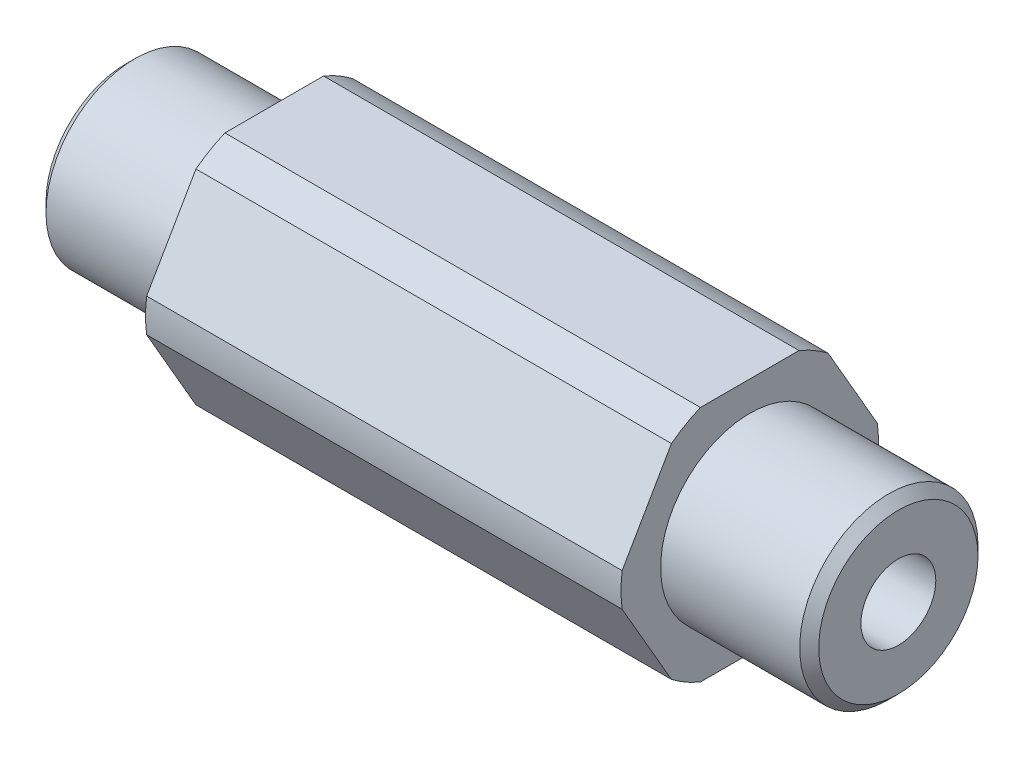
ISO-10303-21;
HEADER;
FILE_DESCRIPTION(('STEP AP214'),'2;1');
FILE_NAME('part.step','',(''),(''),'','','');
FILE_SCHEMA(('AUTOMOTIVE_DESIGN { 1 0 10303 214 1 1 1 1 }'));
ENDSEC;
DATA;
#1=APPLICATION_CONTEXT('core data for automotive mechanical design processes');
#2=APPLICATION_PROTOCOL_DEFINITION('international standard','automotive_design',2000,#1);
#3=PRODUCT_CONTEXT('',#1,'mechanical');
#4=PRODUCT('Part','Part','',(#3));
#5=PRODUCT_RELATED_PRODUCT_CATEGORY('part','',(#4));
#6=PRODUCT_DEFINITION_FORMATION('','',#4);
#7=PRODUCT_DEFINITION_CONTEXT('part definition',#1,'design');
#8=PRODUCT_DEFINITION('design','',#6,#7);
#9=PRODUCT_DEFINITION_SHAPE('','',#8);
#10=(LENGTH_UNIT() NAMED_UNIT(*) SI_UNIT(.MILLI.,.METRE.));
#11=(NAMED_UNIT(*) PLANE_ANGLE_UNIT() SI_UNIT($,.RADIAN.));
#12=(NAMED_UNIT(*) SI_UNIT($,.STERADIAN.) SOLID_ANGLE_UNIT());
#13=UNCERTAINTY_MEASURE_WITH_UNIT(LENGTH_MEASURE(1.E-05),#10,'distance_accuracy_value','');
#14=(GEOMETRIC_REPRESENTATION_CONTEXT(3) GLOBAL_UNCERTAINTY_ASSIGNED_CONTEXT((#13)) GLOBAL_UNIT_ASSIGNED_CONTEXT((#10,
#11,#12)) REPRESENTATION_CONTEXT('',''));
#15=CARTESIAN_POINT('',(0.,0.,0.));
#16=DIRECTION('',(0.,0.,1.));
#17=DIRECTION('',(1.,0.,0.));
#18=AXIS2_PLACEMENT_3D('',#15,#16,#17);
#19=CARTESIAN_POINT('',(101.6,-175.774150125877,90.3852650004529));
#20=DIRECTION('',(0.,-0.5,0.866025403784438));
#21=DIRECTION('',(0.,-0.866025403784438,-0.5));
#22=AXIS2_PLACEMENT_3D('',#19,#20,#21);
#23=PLANE('',#22);
#24=DIRECTION('',(0.,0.866025403784438,0.5));
#25=VECTOR('',#24,1.);
#26=CARTESIAN_POINT('',(93.6625,-175.774150125877,90.3852650004529));
#27=LINE('',#26,#25);
#28=CARTESIAN_POINT('',(93.6625,-178.054968768334,89.0684337432582));
#29=VERTEX_POINT('',#28);
#30=CARTESIAN_POINT('',(93.6625,-173.493331483421,91.7020962576476));
#31=VERTEX_POINT('',#30);
#32=EDGE_CURVE('E34',#29,#31,#27,.T.);
#33=ORIENTED_EDGE('',*,*,#32,.F.);
#34=DIRECTION('',(-1.,0.,0.));
#35=VECTOR('',#34,1.);
#36=CARTESIAN_POINT('',(101.6,-178.054968768334,89.0684337432582));
#37=LINE('',#36,#35);
#38=CARTESIAN_POINT('',(68.2625,-178.054968768334,89.0684337432582));
#39=VERTEX_POINT('',#38);
#40=EDGE_CURVE('E254',#29,#39,#37,.T.);
#41=ORIENTED_EDGE('',*,*,#40,.T.);
#42=DIRECTION('',(0.,-0.866025403784438,-0.5));
#43=VECTOR('',#42,1.);
#44=CARTESIAN_POINT('',(68.2625,-175.774150125877,90.3852650004529));
#45=LINE('',#44,#43);
#46=CARTESIAN_POINT('',(68.2625,-173.493331483421,91.7020962576476));
#47=VERTEX_POINT('',#46);
#48=EDGE_CURVE('E154',#47,#39,#45,.T.);
#49=ORIENTED_EDGE('',*,*,#48,.F.);
#50=DIRECTION('',(-1.,0.,0.));
#51=VECTOR('',#50,1.);
#52=CARTESIAN_POINT('',(101.6,-173.493331483421,91.7020962576476));
#53=LINE('',#52,#51);
#54=EDGE_CURVE('E257',#47,#31,#53,.F.);
#55=ORIENTED_EDGE('',*,*,#54,.T.);
#56=EDGE_LOOP('',(#33,#41,#49,#55));
#57=FACE_BOUND('',#56,.T.);
#58=ADVANCED_FACE('F17',(#57),#23,.F.);
#59=CARTESIAN_POINT('',(101.6,-172.598876643156,95.8850000004529));
#60=DIRECTION('',(0.,-1.,0.));
#61=DIRECTION('',(0.,0.,-1.));
#62=AXIS2_PLACEMENT_3D('',#59,#60,#61);
#63=PLANE('',#62);
#64=DIRECTION('',(0.,0.,1.));
#65=VECTOR('',#64,1.);
#66=CARTESIAN_POINT('',(93.6625,-172.598876643156,95.8850000004529));
#67=LINE('',#66,#65);
#68=CARTESIAN_POINT('',(93.6625,-172.598876643156,93.2513374860635));
#69=VERTEX_POINT('',#68);
#70=CARTESIAN_POINT('',(93.6625,-172.598876643156,98.5186625148424));
#71=VERTEX_POINT('',#70);
#72=EDGE_CURVE('E195',#69,#71,#67,.T.);
#73=ORIENTED_EDGE('',*,*,#72,.F.);
#74=DIRECTION('',(-1.,0.,0.));
#75=VECTOR('',#74,1.);
#76=CARTESIAN_POINT('',(101.6,-172.598876643156,93.2513374860635));
#77=LINE('',#76,#75);
#78=CARTESIAN_POINT('',(68.2625,-172.598876643156,93.2513374860635));
#79=VERTEX_POINT('',#78);
#80=EDGE_CURVE('E247',#69,#79,#77,.T.);
#81=ORIENTED_EDGE('',*,*,#80,.T.);
#82=DIRECTION('',(0.,0.,-1.));
#83=VECTOR('',#82,1.);
#84=CARTESIAN_POINT('',(68.2625,-172.598876643156,95.8850000004529));
#85=LINE('',#84,#83);
#86=CARTESIAN_POINT('',(68.2625,-172.598876643156,98.5186625148424));
#87=VERTEX_POINT('',#86);
#88=EDGE_CURVE('E170',#87,#79,#85,.T.);
#89=ORIENTED_EDGE('',*,*,#88,.F.);
#90=DIRECTION('',(-1.,0.,0.));
#91=VECTOR('',#90,1.);
#92=CARTESIAN_POINT('',(101.6,-172.598876643156,98.5186625148424));
#93=LINE('',#92,#91);
#94=EDGE_CURVE('E250',#87,#71,#93,.F.);
#95=ORIENTED_EDGE('',*,*,#94,.T.);
#96=EDGE_LOOP('',(#73,#81,#89,#95));
#97=FACE_BOUND('',#96,.T.);
#98=ADVANCED_FACE('F289',(#97),#63,.F.);
#99=CARTESIAN_POINT('',(101.6,-175.774150125877,101.384735000453));
#100=DIRECTION('',(0.,-0.5,-0.866025403784438));
#101=DIRECTION('',(0.,0.866025403784438,-0.5));
#102=AXIS2_PLACEMENT_3D('',#99,#100,#101);
#103=PLANE('',#102);
#104=DIRECTION('',(0.,-0.866025403784438,0.5));
#105=VECTOR('',#104,1.);
#106=CARTESIAN_POINT('',(93.6625,-175.774150125877,101.384735000453));
#107=LINE('',#106,#105);
#108=CARTESIAN_POINT('',(93.6625,-173.493331483421,100.067903743258));
#109=VERTEX_POINT('',#108);
#110=CARTESIAN_POINT('',(93.6625,-178.054968768334,102.701566257648));
#111=VERTEX_POINT('',#110);
#112=EDGE_CURVE('E209',#109,#111,#107,.T.);
#113=ORIENTED_EDGE('',*,*,#112,.F.);
#114=DIRECTION('',(-1.,0.,0.));
#115=VECTOR('',#114,1.);
#116=CARTESIAN_POINT('',(101.6,-173.493331483421,100.067903743258));
#117=LINE('',#116,#115);
#118=CARTESIAN_POINT('',(68.2625,-173.493331483421,100.067903743258));
#119=VERTEX_POINT('',#118);
#120=EDGE_CURVE('E240',#109,#119,#117,.T.);
#121=ORIENTED_EDGE('',*,*,#120,.T.);
#122=DIRECTION('',(0.,0.866025403784438,-0.5));
#123=VECTOR('',#122,1.);
#124=CARTESIAN_POINT('',(68.2625,-175.774150125877,101.384735000453));
#125=LINE('',#124,#123);
#126=CARTESIAN_POINT('',(68.2625,-178.054968768334,102.701566257648));
#127=VERTEX_POINT('',#126);
#128=EDGE_CURVE('E174',#127,#119,#125,.T.);
#129=ORIENTED_EDGE('',*,*,#128,.F.);
#130=DIRECTION('',(-1.,0.,0.));
#131=VECTOR('',#130,1.);
#132=CARTESIAN_POINT('',(101.6,-178.054968768334,102.701566257648));
#133=LINE('',#132,#131);
#134=EDGE_CURVE('E243',#127,#111,#133,.F.);
#135=ORIENTED_EDGE('',*,*,#134,.T.);
#136=EDGE_LOOP('',(#113,#121,#129,#135));
#137=FACE_BOUND('',#136,.T.);
#138=ADVANCED_FACE('F293',(#137),#103,.F.);
#139=CARTESIAN_POINT('',(101.6,-182.124697091321,101.384735000453));
#140=DIRECTION('',(0.,0.5,-0.866025403784438));
#141=DIRECTION('',(0.,0.866025403784438,0.5));
#142=AXIS2_PLACEMENT_3D('',#139,#140,#141);
#143=PLANE('',#142);
#144=DIRECTION('',(0.,-0.866025403784438,-0.5));
#145=VECTOR('',#144,1.);
#146=CARTESIAN_POINT('',(93.6625,-182.124697091321,101.384735000453));
#147=LINE('',#146,#145);
#148=CARTESIAN_POINT('',(93.6625,-179.843878448865,102.701566257648));
#149=VERTEX_POINT('',#148);
#150=CARTESIAN_POINT('',(93.6625,-184.405515733777,100.067903743258));
#151=VERTEX_POINT('',#150);
#152=EDGE_CURVE('E41',#149,#151,#147,.T.);
#153=ORIENTED_EDGE('',*,*,#152,.F.);
#154=DIRECTION('',(-1.,0.,0.));
#155=VECTOR('',#154,1.);
#156=CARTESIAN_POINT('',(101.6,-179.843878448865,102.701566257648));
#157=LINE('',#156,#155);
#158=CARTESIAN_POINT('',(68.2625,-179.843878448865,102.701566257648));
#159=VERTEX_POINT('',#158);
#160=EDGE_CURVE('E118',#149,#159,#157,.T.);
#161=ORIENTED_EDGE('',*,*,#160,.T.);
#162=DIRECTION('',(0.,0.866025403784438,0.5));
#163=VECTOR('',#162,1.);
#164=CARTESIAN_POINT('',(68.2625,-182.124697091321,101.384735000453));
#165=LINE('',#164,#163);
#166=CARTESIAN_POINT('',(68.2625,-184.405515733777,100.067903743258));
#167=VERTEX_POINT('',#166);
#168=EDGE_CURVE('E158',#167,#159,#165,.T.);
#169=ORIENTED_EDGE('',*,*,#168,.F.);
#170=DIRECTION('',(-1.,0.,0.));
#171=VECTOR('',#170,1.);
#172=CARTESIAN_POINT('',(101.6,-184.405515733777,100.067903743258));
#173=LINE('',#172,#171);
#174=EDGE_CURVE('E236',#167,#151,#173,.F.);
#175=ORIENTED_EDGE('',*,*,#174,.T.);
#176=EDGE_LOOP('',(#153,#161,#169,#175));
#177=FACE_BOUND('',#176,.T.);
#178=ADVANCED_FACE('F299',(#177),#143,.F.);
#179=CARTESIAN_POINT('',(101.6,-185.299970574042,95.8850000004529));
#180=DIRECTION('',(0.,1.,0.));
#181=DIRECTION('',(0.,0.,1.));
#182=AXIS2_PLACEMENT_3D('',#179,#180,#181);
#183=PLANE('',#182);
#184=DIRECTION('',(0.,0.,-1.));
#185=VECTOR('',#184,1.);
#186=CARTESIAN_POINT('',(93.6625,-185.299970574042,95.8850000004529));
#187=LINE('',#186,#185);
#188=CARTESIAN_POINT('',(93.6625,-185.299970574042,98.5186625148424));
#189=VERTEX_POINT('',#188);
#190=CARTESIAN_POINT('',(93.6625,-185.299970574042,93.2513374860635));
#191=VERTEX_POINT('',#190);
#192=EDGE_CURVE('E217',#189,#191,#187,.T.);
#193=ORIENTED_EDGE('',*,*,#192,.F.);
#194=DIRECTION('',(-1.,0.,0.));
#195=VECTOR('',#194,1.);
#196=CARTESIAN_POINT('',(101.6,-185.299970574042,98.5186625148424));
#197=LINE('',#196,#195);
#198=CARTESIAN_POINT('',(68.2625,-185.299970574042,98.5186625148424));
#199=VERTEX_POINT('',#198);
#200=EDGE_CURVE('E119',#189,#199,#197,.T.);
#201=ORIENTED_EDGE('',*,*,#200,.T.);
#202=DIRECTION('',(0.,0.,1.));
#203=VECTOR('',#202,1.);
#204=CARTESIAN_POINT('',(68.2625,-185.299970574042,95.8850000004529));
#205=LINE('',#204,#203);
#206=CARTESIAN_POINT('',(68.2625,-185.299970574042,93.2513374860635));
#207=VERTEX_POINT('',#206);
#208=EDGE_CURVE('E127',#207,#199,#205,.T.);
#209=ORIENTED_EDGE('',*,*,#208,.F.);
#210=DIRECTION('',(-1.,0.,0.));
#211=VECTOR('',#210,1.);
#212=CARTESIAN_POINT('',(101.6,-185.299970574042,93.2513374860635));
#213=LINE('',#212,#211);
#214=EDGE_CURVE('E108',#207,#191,#213,.F.);
#215=ORIENTED_EDGE('',*,*,#214,.T.);
#216=EDGE_LOOP('',(#193,#201,#209,#215));
#217=FACE_BOUND('',#216,.T.);
#218=ADVANCED_FACE('F136',(#217),#183,.F.);
#219=CARTESIAN_POINT('',(101.6,-182.124697091321,90.3852650004529));
#220=DIRECTION('',(0.,0.5,0.866025403784438));
#221=DIRECTION('',(0.,-0.866025403784438,0.5));
#222=AXIS2_PLACEMENT_3D('',#219,#220,#221);
#223=PLANE('',#222);
#224=DIRECTION('',(0.,0.866025403784438,-0.5));
#225=VECTOR('',#224,1.);
#226=CARTESIAN_POINT('',(93.6625,-182.124697091321,90.3852650004529));
#227=LINE('',#226,#225);
#228=CARTESIAN_POINT('',(93.6625,-184.405515733777,91.7020962576476));
#229=VERTEX_POINT('',#228);
#230=CARTESIAN_POINT('',(93.6625,-179.843878448865,89.0684337432582));
#231=VERTEX_POINT('',#230);
#232=EDGE_CURVE('E206',#229,#231,#227,.T.);
#233=ORIENTED_EDGE('',*,*,#232,.F.);
#234=DIRECTION('',(-1.,0.,0.));
#235=VECTOR('',#234,1.);
#236=CARTESIAN_POINT('',(101.6,-184.405515733777,91.7020962576476));
#237=LINE('',#236,#235);
#238=CARTESIAN_POINT('',(68.2625,-184.405515733777,91.7020962576476));
#239=VERTEX_POINT('',#238);
#240=EDGE_CURVE('E225',#229,#239,#237,.T.);
#241=ORIENTED_EDGE('',*,*,#240,.T.);
#242=DIRECTION('',(0.,-0.866025403784438,0.5));
#243=VECTOR('',#242,1.);
#244=CARTESIAN_POINT('',(68.2625,-182.124697091321,90.3852650004529));
#245=LINE('',#244,#243);
#246=CARTESIAN_POINT('',(68.2625,-179.843878448865,89.0684337432582));
#247=VERTEX_POINT('',#246);
#248=EDGE_CURVE('E131',#247,#239,#245,.T.);
#249=ORIENTED_EDGE('',*,*,#248,.F.);
#250=DIRECTION('',(-1.,0.,0.));
#251=VECTOR('',#250,1.);
#252=CARTESIAN_POINT('',(101.6,-179.843878448865,89.0684337432582));
#253=LINE('',#252,#251);
#254=EDGE_CURVE('E228',#247,#231,#253,.F.);
#255=ORIENTED_EDGE('',*,*,#254,.T.);
#256=EDGE_LOOP('',(#233,#241,#249,#255));
#257=FACE_BOUND('',#256,.T.);
#258=ADVANCED_FACE('F306',(#257),#223,.F.);
#259=CARTESIAN_POINT('',(101.6,-178.949423608599,95.8850000004529));
#260=DIRECTION('',(1.,0.,0.));
#261=DIRECTION('',(0.,0.,-1.));
#262=AXIS2_PLACEMENT_3D('',#259,#260,#261);
#263=PLANE('',#262);
#264=CARTESIAN_POINT('',(101.6,-178.949423608599,95.8850000004529));
#265=DIRECTION('',(1.,0.,0.));
#266=DIRECTION('',(0.,0.,-1.));
#267=AXIS2_PLACEMENT_3D('',#264,#265,#266);
#268=CIRCLE('',#267,4.2545);
#269=CARTESIAN_POINT('',(101.6,-178.949423608599,91.6305000004529));
#270=VERTEX_POINT('',#269);
#271=EDGE_CURVE('E27',#270,#270,#268,.T.);
#272=ORIENTED_EDGE('',*,*,#271,.T.);
#273=EDGE_LOOP('',(#272));
#274=FACE_BOUND('',#273,.T.);
#275=CARTESIAN_POINT('',(101.6,-178.949423608599,95.8850000004529));
#276=DIRECTION('',(1.,0.,0.));
#277=DIRECTION('',(0.,0.,-1.));
#278=AXIS2_PLACEMENT_3D('',#275,#276,#277);
#279=CIRCLE('',#278,2.);
#280=CARTESIAN_POINT('',(101.6,-178.949423608599,93.8850000004529));
#281=VERTEX_POINT('',#280);
#282=EDGE_CURVE('E261',#281,#281,#279,.T.);
#283=ORIENTED_EDGE('',*,*,#282,.F.);
#284=EDGE_LOOP('',(#283));
#285=FACE_BOUND('',#284,.T.);
#286=ADVANCED_FACE('F271',(#274,#285),#263,.T.);
#287=CARTESIAN_POINT('',(101.6,-178.949423608599,95.8850000004529));
#288=DIRECTION('',(-1.,0.,0.));
#289=DIRECTION('',(0.,0.,1.));
#290=AXIS2_PLACEMENT_3D('',#287,#288,#289);
#291=CYLINDRICAL_SURFACE('',#290,6.875);
#292=CARTESIAN_POINT('',(93.6625,-178.949423608599,95.8850000004529));
#293=DIRECTION('',(1.,0.,0.));
#294=DIRECTION('',(0.,0.,-1.));
#295=AXIS2_PLACEMENT_3D('',#292,#293,#294);
#296=CIRCLE('',#295,6.875);
#297=EDGE_CURVE('E113',#191,#229,#296,.T.);
#298=ORIENTED_EDGE('',*,*,#297,.F.);
#299=ORIENTED_EDGE('',*,*,#214,.F.);
#300=CARTESIAN_POINT('',(68.2625,-178.949423608599,95.8850000004529));
#301=DIRECTION('',(-1.,0.,0.));
#302=DIRECTION('',(0.,0.,1.));
#303=AXIS2_PLACEMENT_3D('',#300,#301,#302);
#304=CIRCLE('',#303,6.875);
#305=EDGE_CURVE('E112',#239,#207,#304,.T.);
#306=ORIENTED_EDGE('',*,*,#305,.F.);
#307=ORIENTED_EDGE('',*,*,#240,.F.);
#308=EDGE_LOOP('',(#298,#299,#306,#307));
#309=FACE_BOUND('',#308,.T.);
#310=ADVANCED_FACE('F110',(#309),#291,.T.);
#311=CARTESIAN_POINT('',(93.6625,-178.949423608599,95.8850000004529));
#312=DIRECTION('',(1.,0.,0.));
#313=DIRECTION('',(0.,0.,-1.));
#314=AXIS2_PLACEMENT_3D('',#311,#312,#313);
#315=CIRCLE('',#314,6.875);
#316=EDGE_CURVE('E203',#231,#29,#315,.T.);
#317=ORIENTED_EDGE('',*,*,#316,.F.);
#318=ORIENTED_EDGE('',*,*,#254,.F.);
#319=CARTESIAN_POINT('',(68.2625,-178.949423608599,95.8850000004529));
#320=DIRECTION('',(-1.,0.,0.));
#321=DIRECTION('',(0.,0.,1.));
#322=AXIS2_PLACEMENT_3D('',#319,#320,#321);
#323=CIRCLE('',#322,6.875);
#324=EDGE_CURVE('E151',#39,#247,#323,.T.);
#325=ORIENTED_EDGE('',*,*,#324,.F.);
#326=ORIENTED_EDGE('',*,*,#40,.F.);
#327=EDGE_LOOP('',(#317,#318,#325,#326));
#328=FACE_BOUND('',#327,.T.);
#329=ADVANCED_FACE('F318',(#328),#291,.T.);
#330=CARTESIAN_POINT('',(93.6625,-178.949423608599,95.8850000004529));
#331=DIRECTION('',(1.,0.,0.));
#332=DIRECTION('',(0.,0.,-1.));
#333=AXIS2_PLACEMENT_3D('',#330,#331,#332);
#334=CIRCLE('',#333,6.875);
#335=EDGE_CURVE('E222',#151,#189,#334,.T.);
#336=ORIENTED_EDGE('',*,*,#335,.F.);
#337=ORIENTED_EDGE('',*,*,#174,.F.);
#338=CARTESIAN_POINT('',(68.2625,-178.949423608599,95.8850000004529));
#339=DIRECTION('',(-1.,0.,0.));
#340=DIRECTION('',(0.,0.,1.));
#341=AXIS2_PLACEMENT_3D('',#338,#339,#340);
#342=CIRCLE('',#341,6.875);
#343=EDGE_CURVE('E143',#199,#167,#342,.T.);
#344=ORIENTED_EDGE('',*,*,#343,.F.);
#345=ORIENTED_EDGE('',*,*,#200,.F.);
#346=EDGE_LOOP('',(#336,#337,#344,#345));
#347=FACE_BOUND('',#346,.T.);
#348=ADVANCED_FACE('F408',(#347),#291,.T.);
#349=CARTESIAN_POINT('',(93.6625,-178.949423608599,95.8850000004529));
#350=DIRECTION('',(1.,0.,0.));
#351=DIRECTION('',(0.,0.,-1.));
#352=AXIS2_PLACEMENT_3D('',#349,#350,#351);
#353=CIRCLE('',#352,6.875);
#354=EDGE_CURVE('E212',#111,#149,#353,.T.);
#355=ORIENTED_EDGE('',*,*,#354,.F.);
#356=ORIENTED_EDGE('',*,*,#134,.F.);
#357=CARTESIAN_POINT('',(68.2625,-178.949423608599,95.8850000004529));
#358=DIRECTION('',(-1.,0.,0.));
#359=DIRECTION('',(0.,0.,1.));
#360=AXIS2_PLACEMENT_3D('',#357,#358,#359);
#361=CIRCLE('',#360,6.875);
#362=EDGE_CURVE('E162',#159,#127,#361,.T.);
#363=ORIENTED_EDGE('',*,*,#362,.F.);
#364=ORIENTED_EDGE('',*,*,#160,.F.);
#365=EDGE_LOOP('',(#355,#356,#363,#364));
#366=FACE_BOUND('',#365,.T.);
#367=ADVANCED_FACE('F400',(#366),#291,.T.);
#368=CARTESIAN_POINT('',(93.6625,-178.949423608599,95.8850000004529));
#369=DIRECTION('',(1.,0.,0.));
#370=DIRECTION('',(0.,0.,-1.));
#371=AXIS2_PLACEMENT_3D('',#368,#369,#370);
#372=CIRCLE('',#371,6.875);
#373=EDGE_CURVE('E200',#71,#109,#372,.T.);
#374=ORIENTED_EDGE('',*,*,#373,.F.);
#375=ORIENTED_EDGE('',*,*,#94,.F.);
#376=CARTESIAN_POINT('',(68.2625,-178.949423608599,95.8850000004529));
#377=DIRECTION('',(-1.,0.,0.));
#378=DIRECTION('',(0.,0.,1.));
#379=AXIS2_PLACEMENT_3D('',#376,#377,#378);
#380=CIRCLE('',#379,6.875);
#381=EDGE_CURVE('E178',#119,#87,#380,.T.);
#382=ORIENTED_EDGE('',*,*,#381,.F.);
#383=ORIENTED_EDGE('',*,*,#120,.F.);
#384=EDGE_LOOP('',(#374,#375,#382,#383));
#385=FACE_BOUND('',#384,.T.);
#386=ADVANCED_FACE('F392',(#385),#291,.T.);
#387=CARTESIAN_POINT('',(93.6625,-178.949423608599,95.8850000004529));
#388=DIRECTION('',(1.,0.,0.));
#389=DIRECTION('',(0.,0.,-1.));
#390=AXIS2_PLACEMENT_3D('',#387,#388,#389);
#391=CIRCLE('',#390,6.875);
#392=EDGE_CURVE('E265',#31,#69,#391,.T.);
#393=ORIENTED_EDGE('',*,*,#392,.F.);
#394=ORIENTED_EDGE('',*,*,#54,.F.);
#395=CARTESIAN_POINT('',(68.2625,-178.949423608599,95.8850000004529));
#396=DIRECTION('',(-1.,0.,0.));
#397=DIRECTION('',(0.,0.,1.));
#398=AXIS2_PLACEMENT_3D('',#395,#396,#397);
#399=CIRCLE('',#398,6.875);
#400=EDGE_CURVE('E166',#79,#47,#399,.T.);
#401=ORIENTED_EDGE('',*,*,#400,.F.);
#402=ORIENTED_EDGE('',*,*,#80,.F.);
#403=EDGE_LOOP('',(#393,#394,#401,#402));
#404=FACE_BOUND('',#403,.T.);
#405=ADVANCED_FACE('F315',(#404),#291,.T.);
#406=CARTESIAN_POINT('',(101.6,-178.949423608599,95.8850000004529));
#407=DIRECTION('',(-1.,0.,0.));
#408=DIRECTION('',(0.,0.,1.));
#409=AXIS2_PLACEMENT_3D('',#406,#407,#408);
#410=CYLINDRICAL_SURFACE('',#409,2.);
#411=ORIENTED_EDGE('',*,*,#282,.T.);
#412=EDGE_LOOP('',(#411));
#413=FACE_BOUND('',#412,.T.);
#414=CARTESIAN_POINT('',(60.325,-178.949423608599,95.8850000004529));
#415=DIRECTION('',(-1.,0.,0.));
#416=DIRECTION('',(0.,0.,1.));
#417=AXIS2_PLACEMENT_3D('',#414,#415,#416);
#418=CIRCLE('',#417,2.);
#419=CARTESIAN_POINT('',(60.325,-178.949423608599,97.8850000004529));
#420=VERTEX_POINT('',#419);
#421=EDGE_CURVE('E134',#420,#420,#418,.T.);
#422=ORIENTED_EDGE('',*,*,#421,.T.);
#423=EDGE_LOOP('',(#422));
#424=FACE_BOUND('',#423,.T.);
#425=ADVANCED_FACE('F312',(#413,#424),#410,.F.);
#426=CARTESIAN_POINT('',(93.6625,-178.949423608599,95.8850000004529));
#427=DIRECTION('',(1.,0.,0.));
#428=DIRECTION('',(0.,0.,-1.));
#429=AXIS2_PLACEMENT_3D('',#426,#427,#428);
#430=PLANE('',#429);
#431=CARTESIAN_POINT('',(93.6625,-178.949423608599,95.8850000004529));
#432=DIRECTION('',(1.,0.,0.));
#433=DIRECTION('',(0.,0.,-1.));
#434=AXIS2_PLACEMENT_3D('',#431,#432,#433);
#435=CIRCLE('',#434,4.7625);
#436=CARTESIAN_POINT('',(93.6625,-178.949423608599,91.1225000004529));
#437=VERTEX_POINT('',#436);
#438=EDGE_CURVE('E191',#437,#437,#435,.T.);
#439=ORIENTED_EDGE('',*,*,#438,.F.);
#440=EDGE_LOOP('',(#439));
#441=FACE_BOUND('',#440,.T.);
#442=ORIENTED_EDGE('',*,*,#335,.T.);
#443=ORIENTED_EDGE('',*,*,#192,.T.);
#444=ORIENTED_EDGE('',*,*,#297,.T.);
#445=ORIENTED_EDGE('',*,*,#232,.T.);
#446=ORIENTED_EDGE('',*,*,#316,.T.);
#447=ORIENTED_EDGE('',*,*,#32,.T.);
#448=ORIENTED_EDGE('',*,*,#392,.T.);
#449=ORIENTED_EDGE('',*,*,#72,.T.);
#450=ORIENTED_EDGE('',*,*,#373,.T.);
#451=ORIENTED_EDGE('',*,*,#112,.T.);
#452=ORIENTED_EDGE('',*,*,#354,.T.);
#453=ORIENTED_EDGE('',*,*,#152,.T.);
#454=EDGE_LOOP('',(#442,#443,#444,#445,#446,#447,#448,#449,#450,#451,#452,#453));
#455=FACE_BOUND('',#454,.T.);
#456=ADVANCED_FACE('F284',(#441,#455),#430,.T.);
#457=CARTESIAN_POINT('',(93.6625,-178.949423608599,95.8850000004529));
#458=DIRECTION('',(1.,0.,0.));
#459=DIRECTION('',(0.,0.,-1.));
#460=AXIS2_PLACEMENT_3D('',#457,#458,#459);
#461=CYLINDRICAL_SURFACE('',#460,4.7625);
#462=CARTESIAN_POINT('',(101.092,-178.949423608599,95.8850000004529));
#463=DIRECTION('',(1.,0.,0.));
#464=DIRECTION('',(0.,0.,-1.));
#465=AXIS2_PLACEMENT_3D('',#462,#463,#464);
#466=CIRCLE('',#465,4.7625);
#467=CARTESIAN_POINT('',(101.092,-178.949423608599,91.1225000004529));
#468=VERTEX_POINT('',#467);
#469=EDGE_CURVE('E11',#468,#468,#466,.F.);
#470=ORIENTED_EDGE('',*,*,#469,.T.);
#471=EDGE_LOOP('',(#470));
#472=FACE_BOUND('',#471,.T.);
#473=ORIENTED_EDGE('',*,*,#438,.T.);
#474=EDGE_LOOP('',(#473));
#475=FACE_BOUND('',#474,.T.);
#476=ADVANCED_FACE('F276',(#472,#475),#461,.T.);
#477=CARTESIAN_POINT('',(101.6,-178.949423608599,95.8850000004529));
#478=DIRECTION('',(-1.,0.,0.));
#479=DIRECTION('',(0.,0.,1.));
#480=AXIS2_PLACEMENT_3D('',#477,#478,#479);
#481=CONICAL_SURFACE('',#480,4.2545,0.785398163397448);
#482=ORIENTED_EDGE('',*,*,#469,.F.);
#483=EDGE_LOOP('',(#482));
#484=FACE_BOUND('',#483,.T.);
#485=ORIENTED_EDGE('',*,*,#271,.F.);
#486=EDGE_LOOP('',(#485));
#487=FACE_BOUND('',#486,.T.);
#488=ADVANCED_FACE('F20',(#484,#487),#481,.T.);
#489=CARTESIAN_POINT('',(60.325,-178.949423608599,95.8850000004529));
#490=DIRECTION('',(-1.,0.,0.));
#491=DIRECTION('',(0.,0.,-1.));
#492=AXIS2_PLACEMENT_3D('',#489,#490,#491);
#493=PLANE('',#492);
#494=CARTESIAN_POINT('',(60.325,-178.949423608599,95.8850000004529));
#495=DIRECTION('',(-1.,0.,0.));
#496=DIRECTION('',(0.,0.,1.));
#497=AXIS2_PLACEMENT_3D('',#494,#495,#496);
#498=CIRCLE('',#497,4.2545);
#499=CARTESIAN_POINT('',(60.325,-178.949423608599,100.139500000453));
#500=VERTEX_POINT('',#499);
#501=EDGE_CURVE('E133',#500,#500,#498,.T.);
#502=ORIENTED_EDGE('',*,*,#501,.T.);
#503=EDGE_LOOP('',(#502));
#504=FACE_BOUND('',#503,.T.);
#505=ORIENTED_EDGE('',*,*,#421,.F.);
#506=EDGE_LOOP('',(#505));
#507=FACE_BOUND('',#506,.T.);
#508=ADVANCED_FACE('F275',(#504,#507),#493,.T.);
#509=CARTESIAN_POINT('',(68.2625,-178.949423608599,95.8850000004529));
#510=DIRECTION('',(-1.,0.,0.));
#511=DIRECTION('',(0.,0.,-1.));
#512=AXIS2_PLACEMENT_3D('',#509,#510,#511);
#513=PLANE('',#512);
#514=CARTESIAN_POINT('',(68.2625,-178.949423608599,95.8850000004529));
#515=DIRECTION('',(-1.,0.,0.));
#516=DIRECTION('',(0.,0.,1.));
#517=AXIS2_PLACEMENT_3D('',#514,#515,#516);
#518=CIRCLE('',#517,4.7625);
#519=CARTESIAN_POINT('',(68.2625,-178.949423608599,100.647500000453));
#520=VERTEX_POINT('',#519);
#521=EDGE_CURVE('E139',#520,#520,#518,.T.);
#522=ORIENTED_EDGE('',*,*,#521,.F.);
#523=EDGE_LOOP('',(#522));
#524=FACE_BOUND('',#523,.T.);
#525=ORIENTED_EDGE('',*,*,#381,.T.);
#526=ORIENTED_EDGE('',*,*,#88,.T.);
#527=ORIENTED_EDGE('',*,*,#400,.T.);
#528=ORIENTED_EDGE('',*,*,#48,.T.);
#529=ORIENTED_EDGE('',*,*,#324,.T.);
#530=ORIENTED_EDGE('',*,*,#248,.T.);
#531=ORIENTED_EDGE('',*,*,#305,.T.);
#532=ORIENTED_EDGE('',*,*,#208,.T.);
#533=ORIENTED_EDGE('',*,*,#343,.T.);
#534=ORIENTED_EDGE('',*,*,#168,.T.);
#535=ORIENTED_EDGE('',*,*,#362,.T.);
#536=ORIENTED_EDGE('',*,*,#128,.T.);
#537=EDGE_LOOP('',(#525,#526,#527,#528,#529,#530,#531,#532,#533,#534,#535,#536));
#538=FACE_BOUND('',#537,.T.);
#539=ADVANCED_FACE('F125',(#524,#538),#513,.T.);
#540=CARTESIAN_POINT('',(68.2625,-178.949423608599,95.8850000004529));
#541=DIRECTION('',(-1.,0.,0.));
#542=DIRECTION('',(0.,0.,1.));
#543=AXIS2_PLACEMENT_3D('',#540,#541,#542);
#544=CYLINDRICAL_SURFACE('',#543,4.7625);
#545=CARTESIAN_POINT('',(60.833,-178.949423608599,95.8850000004529));
#546=DIRECTION('',(-1.,0.,0.));
#547=DIRECTION('',(0.,0.,1.));
#548=AXIS2_PLACEMENT_3D('',#545,#546,#547);
#549=CIRCLE('',#548,4.7625);
#550=CARTESIAN_POINT('',(60.833,-178.949423608599,100.647500000453));
#551=VERTEX_POINT('',#550);
#552=EDGE_CURVE('E187',#551,#551,#549,.F.);
#553=ORIENTED_EDGE('',*,*,#552,.T.);
#554=EDGE_LOOP('',(#553));
#555=FACE_BOUND('',#554,.T.);
#556=ORIENTED_EDGE('',*,*,#521,.T.);
#557=EDGE_LOOP('',(#556));
#558=FACE_BOUND('',#557,.T.);
#559=ADVANCED_FACE('F329',(#555,#558),#544,.T.);
#560=CARTESIAN_POINT('',(60.325,-178.949423608599,95.8850000004529));
#561=DIRECTION('',(1.,0.,0.));
#562=DIRECTION('',(0.,0.,-1.));
#563=AXIS2_PLACEMENT_3D('',#560,#561,#562);
#564=CONICAL_SURFACE('',#563,4.2545,0.785398163397441);
#565=ORIENTED_EDGE('',*,*,#552,.F.);
#566=EDGE_LOOP('',(#565));
#567=FACE_BOUND('',#566,.T.);
#568=ORIENTED_EDGE('',*,*,#501,.F.);
#569=EDGE_LOOP('',(#568));
#570=FACE_BOUND('',#569,.T.);
#571=ADVANCED_FACE('F324',(#567,#570),#564,.T.);
#572=CLOSED_SHELL('',(#58,#98,#138,#178,#218,#258,#286,#310,#329,#348,#367,#386,#405,#425,#456,
#476,#488,#508,#539,#559,#571));
#573=MANIFOLD_SOLID_BREP('B1',#572);
#574=ADVANCED_BREP_SHAPE_REPRESENTATION('',(#18,#573),#14);
#575=SHAPE_DEFINITION_REPRESENTATION(#9,#574);
ENDSEC;
END-ISO-10303-21;
